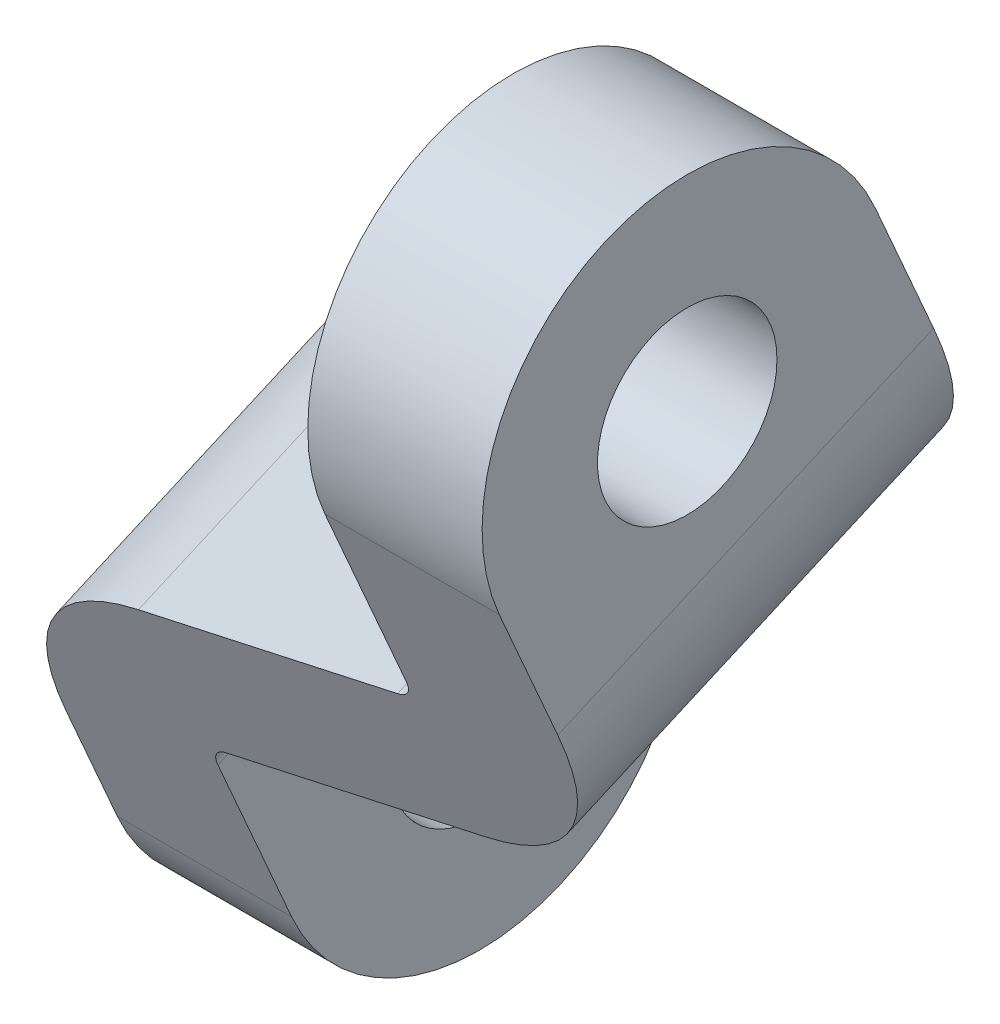
ISO-10303-21;
HEADER;
FILE_DESCRIPTION(('STEP AP214'),'2;1');
FILE_NAME('part.step','',(''),(''),'','','');
FILE_SCHEMA(('AUTOMOTIVE_DESIGN { 1 0 10303 214 1 1 1 1 }'));
ENDSEC;
DATA;
#1=APPLICATION_CONTEXT('core data for automotive mechanical design processes');
#2=APPLICATION_PROTOCOL_DEFINITION('international standard','automotive_design',2000,#1);
#3=PRODUCT_CONTEXT('',#1,'mechanical');
#4=PRODUCT('Part','Part','',(#3));
#5=PRODUCT_RELATED_PRODUCT_CATEGORY('part','',(#4));
#6=PRODUCT_DEFINITION_FORMATION('','',#4);
#7=PRODUCT_DEFINITION_CONTEXT('part definition',#1,'design');
#8=PRODUCT_DEFINITION('design','',#6,#7);
#9=PRODUCT_DEFINITION_SHAPE('','',#8);
#10=(LENGTH_UNIT() NAMED_UNIT(*) SI_UNIT(.MILLI.,.METRE.));
#11=(NAMED_UNIT(*) PLANE_ANGLE_UNIT() SI_UNIT($,.RADIAN.));
#12=(NAMED_UNIT(*) SI_UNIT($,.STERADIAN.) SOLID_ANGLE_UNIT());
#13=UNCERTAINTY_MEASURE_WITH_UNIT(LENGTH_MEASURE(1.E-05),#10,'distance_accuracy_value','');
#14=(GEOMETRIC_REPRESENTATION_CONTEXT(3) GLOBAL_UNCERTAINTY_ASSIGNED_CONTEXT((#13)) GLOBAL_UNIT_ASSIGNED_CONTEXT((#10,
#11,#12)) REPRESENTATION_CONTEXT('',''));
#15=CARTESIAN_POINT('',(0.,0.,0.));
#16=DIRECTION('',(0.,0.,1.));
#17=DIRECTION('',(1.,0.,0.));
#18=AXIS2_PLACEMENT_3D('',#15,#16,#17);
#19=CARTESIAN_POINT('',(-24.3463708891012,-52.740782844802,-46.45));
#20=DIRECTION('',(-1.,0.,0.));
#21=DIRECTION('',(0.,-1.,0.));
#22=AXIS2_PLACEMENT_3D('',#19,#20,#21);
#23=PLANE('',#22);
#24=DIRECTION('',(0.,0.916054362490367,0.401054117248991));
#25=VECTOR('',#24,1.);
#26=CARTESIAN_POINT('',(-24.3463708891012,-67.0218463854487,-48.3357825500385));
#27=LINE('',#26,#25);
#28=CARTESIAN_POINT('',(-24.3463708891012,-56.9496894845637,-43.9261315947217));
#29=VERTEX_POINT('',#28);
#30=CARTESIAN_POINT('',(-24.3463708891012,-54.3449993137979,-42.7857825500387));
#31=VERTEX_POINT('',#30);
#32=EDGE_CURVE('E179',#29,#31,#27,.T.);
#33=ORIENTED_EDGE('',*,*,#32,.F.);
#34=DIRECTION('',(0.,0.401054117248991,-0.916054362490367));
#35=VECTOR('',#34,1.);
#36=CARTESIAN_POINT('',(-24.3463708891012,-55.3454730155679,-47.590349044683));
#37=LINE('',#36,#35);
#38=CARTESIAN_POINT('',(-24.3463708891012,-53.7412565465718,-51.2545664946447));
#39=VERTEX_POINT('',#38);
#40=EDGE_CURVE('E52',#29,#39,#37,.T.);
#41=ORIENTED_EDGE('',*,*,#40,.T.);
#42=DIRECTION('',(0.,-0.916054362490367,-0.401054117248991));
#43=VECTOR('',#42,1.);
#44=CARTESIAN_POINT('',(-24.3463708891012,-51.136566375806,-50.1142174499617));
#45=LINE('',#44,#43);
#46=CARTESIAN_POINT('',(-24.3463708891012,-51.136566375806,-50.1142174499617));
#47=VERTEX_POINT('',#46);
#48=EDGE_CURVE('E242',#47,#39,#45,.T.);
#49=ORIENTED_EDGE('',*,*,#48,.F.);
#50=CARTESIAN_POINT('',(-24.3463708891012,-52.740782844802,-46.45));
#51=DIRECTION('',(-1.,0.,0.));
#52=DIRECTION('',(0.,-1.,0.));
#53=AXIS2_PLACEMENT_3D('',#50,#51,#52);
#54=CIRCLE('',#53,4.00000000000004);
#55=EDGE_CURVE('E249',#31,#47,#54,.T.);
#56=ORIENTED_EDGE('',*,*,#55,.F.);
#57=EDGE_LOOP('',(#33,#41,#49,#56));
#58=FACE_BOUND('',#57,.T.);
#59=CARTESIAN_POINT('',(-24.3463708891012,-52.740782844802,-46.45));
#60=DIRECTION('',(1.,0.,0.));
#61=DIRECTION('',(0.,0.,-1.));
#62=AXIS2_PLACEMENT_3D('',#59,#60,#61);
#63=CIRCLE('',#62,1.75000000000002);
#64=CARTESIAN_POINT('',(-24.3463708891012,-52.740782844802,-48.2));
#65=VERTEX_POINT('',#64);
#66=EDGE_CURVE('E304',#65,#65,#63,.T.);
#67=ORIENTED_EDGE('',*,*,#66,.F.);
#68=EDGE_LOOP('',(#67));
#69=FACE_BOUND('',#68,.T.);
#70=ADVANCED_FACE('F43',(#58,#69),#23,.F.);
#71=CARTESIAN_POINT('',(-24.3463708891012,-52.740782844802,-46.45));
#72=DIRECTION('',(-1.,0.,0.));
#73=DIRECTION('',(0.,-1.,0.));
#74=AXIS2_PLACEMENT_3D('',#71,#72,#73);
#75=CYLINDRICAL_SURFACE('',#74,4.00000000000004);
#76=CARTESIAN_POINT('',(-27.7463708891012,-52.740782844802,-46.45));
#77=DIRECTION('',(1.,0.,0.));
#78=DIRECTION('',(0.,0.,-1.));
#79=AXIS2_PLACEMENT_3D('',#76,#77,#78);
#80=CIRCLE('',#79,4.00000000000004);
#81=CARTESIAN_POINT('',(-27.7463708891012,-54.3449993137979,-42.7857825500387));
#82=VERTEX_POINT('',#81);
#83=CARTESIAN_POINT('',(-27.7463708891012,-51.136566375806,-50.1142174499617));
#84=VERTEX_POINT('',#83);
#85=EDGE_CURVE('E188',#82,#84,#80,.F.);
#86=ORIENTED_EDGE('',*,*,#85,.F.);
#87=DIRECTION('',(-1.,0.,0.));
#88=VECTOR('',#87,1.);
#89=CARTESIAN_POINT('',(-24.3463708891012,-54.3449993137979,-42.7857825500387));
#90=LINE('',#89,#88);
#91=EDGE_CURVE('E165',#31,#82,#90,.T.);
#92=ORIENTED_EDGE('',*,*,#91,.F.);
#93=ORIENTED_EDGE('',*,*,#55,.T.);
#94=DIRECTION('',(-1.,0.,0.));
#95=VECTOR('',#94,1.);
#96=CARTESIAN_POINT('',(-24.3463708891012,-51.136566375806,-50.1142174499617));
#97=LINE('',#96,#95);
#98=EDGE_CURVE('E172',#47,#84,#97,.T.);
#99=ORIENTED_EDGE('',*,*,#98,.T.);
#100=EDGE_LOOP('',(#86,#92,#93,#99));
#101=FACE_BOUND('',#100,.T.);
#102=ADVANCED_FACE('F311',(#101),#75,.T.);
#103=CARTESIAN_POINT('',(-24.3463708891012,-67.0218463854487,-48.3357825500385));
#104=DIRECTION('',(0.,-0.401054117248991,0.916054362490367));
#105=DIRECTION('',(0.,-0.916054362490367,-0.401054117248991));
#106=AXIS2_PLACEMENT_3D('',#103,#104,#105);
#107=PLANE('',#106);
#108=DIRECTION('',(-0.939692620785908,-0.31330904435306,-0.13716858666285));
#109=VECTOR('',#108,1.);
#110=CARTESIAN_POINT('',(-27.787499471829,-58.3610808795735,-44.5440472481985));
#111=LINE('',#110,#109);
#112=CARTESIAN_POINT('',(-34.0564716057295,-60.4512597581792,-45.4591401502974));
#113=VERTEX_POINT('',#112);
#114=CARTESIAN_POINT('',(-28.1411588031058,-58.4789967433974,-44.595671523582));
#115=VERTEX_POINT('',#114);
#116=EDGE_CURVE('E157',#113,#115,#111,.F.);
#117=ORIENTED_EDGE('',*,*,#116,.F.);
#118=CARTESIAN_POINT('',(-32.3463708891012,-64.7553073815339,-47.3434781228708));
#119=DIRECTION('',(0.,-0.401054117248991,0.916054362490367));
#120=DIRECTION('',(0.,-0.916054362490367,-0.401054117248991));
#121=AXIS2_PLACEMENT_3D('',#118,#119,#120);
#122=CIRCLE('',#121,5.);
#123=CARTESIAN_POINT('',(-37.3463708891012,-64.7553073815339,-47.3434781228708));
#124=VERTEX_POINT('',#123);
#125=EDGE_CURVE('E226',#113,#124,#122,.T.);
#126=ORIENTED_EDGE('',*,*,#125,.T.);
#127=DIRECTION('',(0.,0.916054362490367,0.401054117248991));
#128=VECTOR('',#127,1.);
#129=CARTESIAN_POINT('',(-37.3463708891012,-67.0218463854487,-48.3357825500385));
#130=LINE('',#129,#128);
#131=CARTESIAN_POINT('',(-37.3463708891012,-67.0218463854487,-48.3357825500385));
#132=VERTEX_POINT('',#131);
#133=EDGE_CURVE('E163',#132,#124,#130,.T.);
#134=ORIENTED_EDGE('',*,*,#133,.F.);
#135=DIRECTION('',(-1.,0.,0.));
#136=VECTOR('',#135,1.);
#137=CARTESIAN_POINT('',(-24.3463708891012,-67.0218463854487,-48.3357825500385));
#138=LINE('',#137,#136);
#139=CARTESIAN_POINT('',(-33.9463708891012,-67.0218463854487,-48.3357825500385));
#140=VERTEX_POINT('',#139);
#141=EDGE_CURVE('E152',#140,#132,#138,.T.);
#142=ORIENTED_EDGE('',*,*,#141,.F.);
#143=DIRECTION('',(0.,-0.916054362490367,-0.401054117248991));
#144=VECTOR('',#143,1.);
#145=CARTESIAN_POINT('',(-33.9463708891012,-63.3576289354874,-46.7315660810426));
#146=LINE('',#145,#144);
#147=CARTESIAN_POINT('',(-33.9463708891012,-63.7424858375028,-46.9000587507193));
#148=VERTEX_POINT('',#147);
#149=EDGE_CURVE('E133',#148,#140,#146,.T.);
#150=ORIENTED_EDGE('',*,*,#149,.F.);
#151=CARTESIAN_POINT('',(-33.3463708891012,-63.7424858375028,-46.9000587507193));
#152=DIRECTION('',(0.,-0.401054117248991,0.916054362490367));
#153=DIRECTION('',(0.,-0.916054362490367,-0.401054117248991));
#154=AXIS2_PLACEMENT_3D('',#151,#152,#153);
#155=CIRCLE('',#154,0.6);
#156=CARTESIAN_POINT('',(-33.5515829750966,-63.2260001227003,-46.6739381940105));
#157=VERTEX_POINT('',#156);
#158=EDGE_CURVE('E213',#148,#157,#155,.F.);
#159=ORIENTED_EDGE('',*,*,#158,.T.);
#160=DIRECTION('',(-0.939692620785909,-0.313309044353058,-0.137168586662848));
#161=VECTOR('',#160,1.);
#162=CARTESIAN_POINT('',(-18.2703377056118,-58.1309804896816,-44.4433079116204));
#163=LINE('',#162,#161);
#164=CARTESIAN_POINT('',(-27.6362701724729,-61.2537371079184,-45.8104695672952));
#165=VERTEX_POINT('',#164);
#166=EDGE_CURVE('E146',#165,#157,#163,.T.);
#167=ORIENTED_EDGE('',*,*,#166,.F.);
#168=CARTESIAN_POINT('',(-29.3463708891012,-56.9496894845637,-43.9261315947217));
#169=DIRECTION('',(0.,-0.401054117248991,0.916054362490367));
#170=DIRECTION('',(0.,-0.916054362490367,-0.401054117248991));
#171=AXIS2_PLACEMENT_3D('',#168,#169,#170);
#172=CIRCLE('',#171,5.);
#173=EDGE_CURVE('E223',#165,#29,#172,.T.);
#174=ORIENTED_EDGE('',*,*,#173,.T.);
#175=ORIENTED_EDGE('',*,*,#32,.T.);
#176=ORIENTED_EDGE('',*,*,#91,.T.);
#177=DIRECTION('',(0.,0.916054362490367,0.401054117248991));
#178=VECTOR('',#177,1.);
#179=CARTESIAN_POINT('',(-27.7463708891012,-61.5481665314057,-45.9393725422319));
#180=LINE('',#179,#178);
#181=CARTESIAN_POINT('',(-27.7463708891012,-57.9625110285948,-44.3695509668732));
#182=VERTEX_POINT('',#181);
#183=EDGE_CURVE('E189',#182,#82,#180,.T.);
#184=ORIENTED_EDGE('',*,*,#183,.F.);
#185=CARTESIAN_POINT('',(-28.3463708891012,-57.9625110285948,-44.3695509668732));
#186=DIRECTION('',(0.,-0.401054117248991,0.916054362490367));
#187=DIRECTION('',(0.,-0.916054362490367,-0.401054117248991));
#188=AXIS2_PLACEMENT_3D('',#185,#186,#187);
#189=CIRCLE('',#188,0.6);
#190=EDGE_CURVE('E206',#182,#115,#189,.F.);
#191=ORIENTED_EDGE('',*,*,#190,.T.);
#192=EDGE_LOOP('',(#117,#126,#134,#142,#150,#159,#167,#174,#175,#176,#184,#191));
#193=FACE_BOUND('',#192,.T.);
#194=ADVANCED_FACE('F161',(#193),#107,.T.);
#195=CARTESIAN_POINT('',(-24.3463708891012,-65.4176299164527,-52.));
#196=DIRECTION('',(-1.,0.,0.));
#197=DIRECTION('',(0.,-1.,0.));
#198=AXIS2_PLACEMENT_3D('',#195,#196,#197);
#199=CYLINDRICAL_SURFACE('',#198,4.00000000000004);
#200=CARTESIAN_POINT('',(-33.9463708891012,-65.4176299164527,-52.));
#201=DIRECTION('',(-1.,0.,0.));
#202=DIRECTION('',(0.,0.,1.));
#203=AXIS2_PLACEMENT_3D('',#200,#201,#202);
#204=CIRCLE('',#203,4.00000000000004);
#205=CARTESIAN_POINT('',(-33.9463708891012,-63.8134134474567,-55.6642174499615));
#206=VERTEX_POINT('',#205);
#207=EDGE_CURVE('E137',#140,#206,#204,.F.);
#208=ORIENTED_EDGE('',*,*,#207,.F.);
#209=ORIENTED_EDGE('',*,*,#141,.T.);
#210=CARTESIAN_POINT('',(-37.3463708891012,-65.4176299164527,-52.));
#211=DIRECTION('',(-1.,0.,0.));
#212=DIRECTION('',(0.,-1.,0.));
#213=AXIS2_PLACEMENT_3D('',#210,#211,#212);
#214=CIRCLE('',#213,4.00000000000004);
#215=CARTESIAN_POINT('',(-37.3463708891012,-63.8134134474567,-55.6642174499615));
#216=VERTEX_POINT('',#215);
#217=EDGE_CURVE('E260',#216,#132,#214,.T.);
#218=ORIENTED_EDGE('',*,*,#217,.F.);
#219=DIRECTION('',(-1.,0.,0.));
#220=VECTOR('',#219,1.);
#221=CARTESIAN_POINT('',(-24.3463708891012,-63.8134134474567,-55.6642174499615));
#222=LINE('',#221,#220);
#223=EDGE_CURVE('E155',#206,#216,#222,.T.);
#224=ORIENTED_EDGE('',*,*,#223,.F.);
#225=EDGE_LOOP('',(#208,#209,#218,#224));
#226=FACE_BOUND('',#225,.T.);
#227=ADVANCED_FACE('F150',(#226),#199,.T.);
#228=CARTESIAN_POINT('',(-24.3463708891012,-51.136566375806,-50.1142174499617));
#229=DIRECTION('',(0.,0.401054117248991,-0.916054362490367));
#230=DIRECTION('',(0.,0.916054362490367,0.401054117248991));
#231=AXIS2_PLACEMENT_3D('',#228,#229,#230);
#232=PLANE('',#231);
#233=DIRECTION('',(0.,-0.916054362490367,-0.401054117248991));
#234=VECTOR('',#233,1.);
#235=CARTESIAN_POINT('',(-37.3463708891012,-51.136566375806,-50.1142174499617));
#236=LINE('',#235,#234);
#237=CARTESIAN_POINT('',(-37.3463708891012,-61.5468744435419,-54.6719130227938));
#238=VERTEX_POINT('',#237);
#239=EDGE_CURVE('E257',#238,#216,#236,.T.);
#240=ORIENTED_EDGE('',*,*,#239,.F.);
#241=CARTESIAN_POINT('',(-32.3463708891012,-61.5468744435419,-54.6719130227938));
#242=DIRECTION('',(0.,0.401054117248991,-0.916054362490367));
#243=DIRECTION('',(0.,0.916054362490367,0.401054117248991));
#244=AXIS2_PLACEMENT_3D('',#241,#242,#243);
#245=CIRCLE('',#244,5.);
#246=CARTESIAN_POINT('',(-34.0564716057295,-57.2428268201872,-52.7875750502204));
#247=VERTEX_POINT('',#246);
#248=EDGE_CURVE('E234',#238,#247,#245,.T.);
#249=ORIENTED_EDGE('',*,*,#248,.T.);
#250=DIRECTION('',(0.939692620785908,0.31330904435306,0.13716858666285));
#251=VECTOR('',#250,1.);
#252=CARTESIAN_POINT('',(-23.3398812074523,-53.6697385335097,-51.2232554777767));
#253=LINE('',#252,#251);
#254=CARTESIAN_POINT('',(-28.1411588031058,-55.2705638054054,-51.9241064235051));
#255=VERTEX_POINT('',#254);
#256=EDGE_CURVE('E184',#255,#247,#253,.F.);
#257=ORIENTED_EDGE('',*,*,#256,.F.);
#258=CARTESIAN_POINT('',(-28.3463708891012,-54.7540780906028,-51.6979858667962));
#259=DIRECTION('',(0.,0.401054117248991,-0.916054362490367));
#260=DIRECTION('',(0.,0.916054362490367,0.401054117248991));
#261=AXIS2_PLACEMENT_3D('',#258,#259,#260);
#262=CIRCLE('',#261,0.6);
#263=CARTESIAN_POINT('',(-27.7463708891012,-54.7540780906028,-51.6979858667962));
#264=VERTEX_POINT('',#263);
#265=EDGE_CURVE('E210',#255,#264,#262,.F.);
#266=ORIENTED_EDGE('',*,*,#265,.T.);
#267=DIRECTION('',(0.,-0.916054362490367,-0.401054117248991));
#268=VECTOR('',#267,1.);
#269=CARTESIAN_POINT('',(-27.7463708891012,-51.136566375806,-50.1142174499617));
#270=LINE('',#269,#268);
#271=EDGE_CURVE('E170',#84,#264,#270,.T.);
#272=ORIENTED_EDGE('',*,*,#271,.F.);
#273=ORIENTED_EDGE('',*,*,#98,.F.);
#274=ORIENTED_EDGE('',*,*,#48,.T.);
#275=CARTESIAN_POINT('',(-29.3463708891012,-53.7412565465718,-51.2545664946447));
#276=DIRECTION('',(0.,0.401054117248991,-0.916054362490367));
#277=DIRECTION('',(0.,0.916054362490367,0.401054117248991));
#278=AXIS2_PLACEMENT_3D('',#275,#276,#277);
#279=CIRCLE('',#278,5.);
#280=CARTESIAN_POINT('',(-27.6362701724729,-58.0453041699265,-53.1389044672182));
#281=VERTEX_POINT('',#280);
#282=EDGE_CURVE('E59',#39,#281,#279,.T.);
#283=ORIENTED_EDGE('',*,*,#282,.T.);
#284=DIRECTION('',(0.939692620785909,0.313309044353057,0.137168586662849));
#285=VECTOR('',#284,1.);
#286=CARTESIAN_POINT('',(-22.3073145171264,-56.2685423152042,-52.3610274258708));
#287=LINE('',#286,#285);
#288=CARTESIAN_POINT('',(-33.5515829750966,-60.0175671847083,-54.0023730939335));
#289=VERTEX_POINT('',#288);
#290=EDGE_CURVE('E145',#289,#281,#287,.T.);
#291=ORIENTED_EDGE('',*,*,#290,.F.);
#292=CARTESIAN_POINT('',(-33.3463708891012,-60.5340528995109,-54.2284936506423));
#293=DIRECTION('',(0.,0.401054117248991,-0.916054362490367));
#294=DIRECTION('',(0.,0.916054362490367,0.401054117248991));
#295=AXIS2_PLACEMENT_3D('',#292,#293,#294);
#296=CIRCLE('',#295,0.6);
#297=CARTESIAN_POINT('',(-33.9463708891012,-60.5340528995109,-54.2284936506423));
#298=VERTEX_POINT('',#297);
#299=EDGE_CURVE('E216',#289,#298,#296,.F.);
#300=ORIENTED_EDGE('',*,*,#299,.T.);
#301=DIRECTION('',(0.,0.916054362490367,0.401054117248991));
#302=VECTOR('',#301,1.);
#303=CARTESIAN_POINT('',(-33.9463708891012,-51.136566375806,-50.1142174499617));
#304=LINE('',#303,#302);
#305=EDGE_CURVE('E183',#206,#298,#304,.T.);
#306=ORIENTED_EDGE('',*,*,#305,.F.);
#307=ORIENTED_EDGE('',*,*,#223,.T.);
#308=EDGE_LOOP('',(#240,#249,#257,#266,#272,#273,#274,#283,#291,#300,#306,#307));
#309=FACE_BOUND('',#308,.T.);
#310=ADVANCED_FACE('F246',(#309),#232,.T.);
#311=CARTESIAN_POINT('',(-37.3463708891012,-52.740782844802,-46.45));
#312=DIRECTION('',(-1.,0.,0.));
#313=DIRECTION('',(0.,-1.,0.));
#314=AXIS2_PLACEMENT_3D('',#311,#312,#313);
#315=PLANE('',#314);
#316=CARTESIAN_POINT('',(-37.3463708891012,-65.4176299164527,-52.));
#317=DIRECTION('',(-1.,0.,0.));
#318=DIRECTION('',(0.,0.,1.));
#319=AXIS2_PLACEMENT_3D('',#316,#317,#318);
#320=CIRCLE('',#319,1.75000000000002);
#321=CARTESIAN_POINT('',(-37.3463708891012,-65.4176299164527,-50.25));
#322=VERTEX_POINT('',#321);
#323=EDGE_CURVE('E296',#322,#322,#320,.T.);
#324=ORIENTED_EDGE('',*,*,#323,.F.);
#325=EDGE_LOOP('',(#324));
#326=FACE_BOUND('',#325,.T.);
#327=ORIENTED_EDGE('',*,*,#133,.T.);
#328=DIRECTION('',(0.,0.401054117248991,-0.916054362490367));
#329=VECTOR('',#328,1.);
#330=CARTESIAN_POINT('',(-37.3463708891012,-61.5468744435419,-54.6719130227938));
#331=LINE('',#330,#329);
#332=EDGE_CURVE('E229',#124,#238,#331,.T.);
#333=ORIENTED_EDGE('',*,*,#332,.T.);
#334=ORIENTED_EDGE('',*,*,#239,.T.);
#335=ORIENTED_EDGE('',*,*,#217,.T.);
#336=EDGE_LOOP('',(#327,#333,#334,#335));
#337=FACE_BOUND('',#336,.T.);
#338=ADVANCED_FACE('F265',(#326,#337),#315,.T.);
#339=CARTESIAN_POINT('',(-27.7463708891012,-55.792023023719,-59.0870754196053));
#340=DIRECTION('',(1.,0.,0.));
#341=DIRECTION('',(0.,0.,-1.));
#342=AXIS2_PLACEMENT_3D('',#339,#340,#341);
#343=PLANE('',#342);
#344=CARTESIAN_POINT('',(-27.7463708891012,-52.740782844802,-46.45));
#345=DIRECTION('',(1.,0.,0.));
#346=DIRECTION('',(0.,0.,-1.));
#347=AXIS2_PLACEMENT_3D('',#344,#345,#346);
#348=CIRCLE('',#347,1.75000000000002);
#349=CARTESIAN_POINT('',(-27.7463708891012,-52.740782844802,-48.2));
#350=VERTEX_POINT('',#349);
#351=EDGE_CURVE('E300',#350,#350,#348,.T.);
#352=ORIENTED_EDGE('',*,*,#351,.T.);
#353=EDGE_LOOP('',(#352));
#354=FACE_BOUND('',#353,.T.);
#355=ORIENTED_EDGE('',*,*,#271,.T.);
#356=DIRECTION('',(0.,0.401054117248991,-0.916054362490367));
#357=VECTOR('',#356,1.);
#358=CARTESIAN_POINT('',(-27.7463708891012,-57.9625110285948,-44.3695509668732));
#359=LINE('',#358,#357);
#360=EDGE_CURVE('E194',#264,#182,#359,.F.);
#361=ORIENTED_EDGE('',*,*,#360,.T.);
#362=ORIENTED_EDGE('',*,*,#183,.T.);
#363=ORIENTED_EDGE('',*,*,#85,.T.);
#364=EDGE_LOOP('',(#355,#361,#362,#363));
#365=FACE_BOUND('',#364,.T.);
#366=ADVANCED_FACE('F279',(#354,#365),#343,.F.);
#367=CARTESIAN_POINT('',(-37.3463708891012,-59.9439500624098,-49.6035899921932));
#368=DIRECTION('',(-0.342020143325669,0.860809524670937,0.376867594514683));
#369=DIRECTION('',(0.,-0.401054117248991,0.916054362490367));
#370=AXIS2_PLACEMENT_3D('',#367,#368,#369);
#371=PLANE('',#370);
#372=ORIENTED_EDGE('',*,*,#256,.T.);
#373=DIRECTION('',(0.,-0.401054117248991,0.916054362490367));
#374=VECTOR('',#373,1.);
#375=CARTESIAN_POINT('',(-34.0564716057295,-60.4512597581792,-45.4591401502974));
#376=LINE('',#375,#374);
#377=EDGE_CURVE('E219',#247,#113,#376,.T.);
#378=ORIENTED_EDGE('',*,*,#377,.T.);
#379=ORIENTED_EDGE('',*,*,#116,.T.);
#380=DIRECTION('',(0.,-0.401054117248991,0.916054362490367));
#381=VECTOR('',#380,1.);
#382=CARTESIAN_POINT('',(-28.1411588031058,-55.2705638054054,-51.9241064235051));
#383=LINE('',#382,#381);
#384=EDGE_CURVE('E198',#115,#255,#383,.F.);
#385=ORIENTED_EDGE('',*,*,#384,.T.);
#386=EDGE_LOOP('',(#372,#378,#379,#385));
#387=FACE_BOUND('',#386,.T.);
#388=ADVANCED_FACE('F273',(#387),#371,.T.);
#389=CARTESIAN_POINT('',(-33.9463708891012,-57.6014854278007,-59.879268958416));
#390=DIRECTION('',(-1.,0.,0.));
#391=DIRECTION('',(0.,0.,1.));
#392=AXIS2_PLACEMENT_3D('',#389,#390,#391);
#393=PLANE('',#392);
#394=CARTESIAN_POINT('',(-33.9463708891012,-65.4176299164527,-52.));
#395=DIRECTION('',(-1.,0.,0.));
#396=DIRECTION('',(0.,0.,1.));
#397=AXIS2_PLACEMENT_3D('',#394,#395,#396);
#398=CIRCLE('',#397,1.75000000000002);
#399=CARTESIAN_POINT('',(-33.9463708891012,-65.4176299164527,-50.25));
#400=VERTEX_POINT('',#399);
#401=EDGE_CURVE('E292',#400,#400,#398,.T.);
#402=ORIENTED_EDGE('',*,*,#401,.T.);
#403=EDGE_LOOP('',(#402));
#404=FACE_BOUND('',#403,.T.);
#405=ORIENTED_EDGE('',*,*,#305,.T.);
#406=DIRECTION('',(0.,-0.401054117248991,0.916054362490367));
#407=VECTOR('',#406,1.);
#408=CARTESIAN_POINT('',(-33.9463708891012,-63.7424858375028,-46.9000587507193));
#409=LINE('',#408,#407);
#410=EDGE_CURVE('E140',#298,#148,#409,.T.);
#411=ORIENTED_EDGE('',*,*,#410,.T.);
#412=ORIENTED_EDGE('',*,*,#149,.T.);
#413=ORIENTED_EDGE('',*,*,#207,.T.);
#414=EDGE_LOOP('',(#405,#411,#412,#413));
#415=FACE_BOUND('',#414,.T.);
#416=ADVANCED_FACE('F136',(#404,#415),#393,.F.);
#417=CARTESIAN_POINT('',(-18.2703377056118,-52.3748369819949,-57.5910107889938));
#418=DIRECTION('',(-0.342020143325667,0.860809524670938,0.376867594514683));
#419=DIRECTION('',(0.,-0.401054117248991,0.916054362490367));
#420=AXIS2_PLACEMENT_3D('',#417,#418,#419);
#421=PLANE('',#420);
#422=ORIENTED_EDGE('',*,*,#290,.T.);
#423=DIRECTION('',(0.,0.401054117248991,-0.916054362490367));
#424=VECTOR('',#423,1.);
#425=CARTESIAN_POINT('',(-27.6362701724729,-55.4975936002317,-58.9581724446685));
#426=LINE('',#425,#424);
#427=EDGE_CURVE('E11',#281,#165,#426,.F.);
#428=ORIENTED_EDGE('',*,*,#427,.T.);
#429=ORIENTED_EDGE('',*,*,#166,.T.);
#430=DIRECTION('',(0.,-0.401054117248991,0.916054362490367));
#431=VECTOR('',#430,1.);
#432=CARTESIAN_POINT('',(-33.5515829750966,-60.0175671847083,-54.0023730939335));
#433=LINE('',#432,#431);
#434=EDGE_CURVE('E203',#157,#289,#433,.F.);
#435=ORIENTED_EDGE('',*,*,#434,.T.);
#436=EDGE_LOOP('',(#422,#428,#429,#435));
#437=FACE_BOUND('',#436,.T.);
#438=ADVANCED_FACE('F345',(#437),#421,.F.);
#439=CARTESIAN_POINT('',(-37.3463708891012,-65.4176299164527,-52.));
#440=DIRECTION('',(-1.,0.,0.));
#441=DIRECTION('',(0.,0.,1.));
#442=AXIS2_PLACEMENT_3D('',#439,#440,#441);
#443=CYLINDRICAL_SURFACE('',#442,1.75000000000002);
#444=ORIENTED_EDGE('',*,*,#401,.F.);
#445=EDGE_LOOP('',(#444));
#446=FACE_BOUND('',#445,.T.);
#447=ORIENTED_EDGE('',*,*,#323,.T.);
#448=EDGE_LOOP('',(#447));
#449=FACE_BOUND('',#448,.T.);
#450=ADVANCED_FACE('F348',(#446,#449),#443,.F.);
#451=CARTESIAN_POINT('',(-24.3463708891012,-52.740782844802,-46.45));
#452=DIRECTION('',(1.,0.,0.));
#453=DIRECTION('',(0.,0.,-1.));
#454=AXIS2_PLACEMENT_3D('',#451,#452,#453);
#455=CYLINDRICAL_SURFACE('',#454,1.75000000000002);
#456=ORIENTED_EDGE('',*,*,#351,.F.);
#457=EDGE_LOOP('',(#456));
#458=FACE_BOUND('',#457,.T.);
#459=ORIENTED_EDGE('',*,*,#66,.T.);
#460=EDGE_LOOP('',(#459));
#461=FACE_BOUND('',#460,.T.);
#462=ADVANCED_FACE('F309',(#458,#461),#455,.F.);
#463=CARTESIAN_POINT('',(-28.3463708891012,-52.2063675209081,-57.5172538442466));
#464=DIRECTION('',(0.,-0.401054117248991,0.916054362490367));
#465=DIRECTION('',(0.,-0.916054362490367,-0.401054117248991));
#466=AXIS2_PLACEMENT_3D('',#463,#464,#465);
#467=CYLINDRICAL_SURFACE('',#466,0.6);
#468=ORIENTED_EDGE('',*,*,#265,.F.);
#469=ORIENTED_EDGE('',*,*,#384,.F.);
#470=ORIENTED_EDGE('',*,*,#190,.F.);
#471=ORIENTED_EDGE('',*,*,#360,.F.);
#472=EDGE_LOOP('',(#468,#469,#470,#471));
#473=FACE_BOUND('',#472,.T.);
#474=ADVANCED_FACE('F276',(#473),#467,.F.);
#475=CARTESIAN_POINT('',(-33.3463708891012,-57.9863423298161,-60.0477616280927));
#476=DIRECTION('',(0.,0.401054117248991,-0.916054362490367));
#477=DIRECTION('',(0.,0.916054362490367,0.401054117248991));
#478=AXIS2_PLACEMENT_3D('',#475,#476,#477);
#479=CYLINDRICAL_SURFACE('',#478,0.6);
#480=ORIENTED_EDGE('',*,*,#299,.F.);
#481=ORIENTED_EDGE('',*,*,#434,.F.);
#482=ORIENTED_EDGE('',*,*,#158,.F.);
#483=ORIENTED_EDGE('',*,*,#410,.F.);
#484=EDGE_LOOP('',(#480,#481,#482,#483));
#485=FACE_BOUND('',#484,.T.);
#486=ADVANCED_FACE('F333',(#485),#479,.F.);
#487=CARTESIAN_POINT('',(-32.3463708891012,-63.151090912538,-51.0076955728321));
#488=DIRECTION('',(0.,-0.401054117248991,0.916054362490367));
#489=DIRECTION('',(0.,-0.916054362490367,-0.401054117248991));
#490=AXIS2_PLACEMENT_3D('',#487,#488,#489);
#491=CYLINDRICAL_SURFACE('',#490,5.);
#492=ORIENTED_EDGE('',*,*,#248,.F.);
#493=ORIENTED_EDGE('',*,*,#332,.F.);
#494=ORIENTED_EDGE('',*,*,#125,.F.);
#495=ORIENTED_EDGE('',*,*,#377,.F.);
#496=EDGE_LOOP('',(#492,#493,#494,#495));
#497=FACE_BOUND('',#496,.T.);
#498=ADVANCED_FACE('F268',(#497),#491,.T.);
#499=CARTESIAN_POINT('',(-29.3463708891012,-55.3454730155679,-47.590349044683));
#500=DIRECTION('',(0.,0.401054117248991,-0.916054362490367));
#501=DIRECTION('',(0.,0.916054362490367,0.401054117248991));
#502=AXIS2_PLACEMENT_3D('',#499,#500,#501);
#503=CYLINDRICAL_SURFACE('',#502,5.);
#504=ORIENTED_EDGE('',*,*,#173,.F.);
#505=ORIENTED_EDGE('',*,*,#427,.F.);
#506=ORIENTED_EDGE('',*,*,#282,.F.);
#507=ORIENTED_EDGE('',*,*,#40,.F.);
#508=EDGE_LOOP('',(#504,#505,#506,#507));
#509=FACE_BOUND('',#508,.T.);
#510=ADVANCED_FACE('F45',(#509),#503,.T.);
#511=CLOSED_SHELL('',(#70,#102,#194,#227,#310,#338,#366,#388,#416,#438,#450,#462,#474,#486,#498,#510));
#512=MANIFOLD_SOLID_BREP('B2',#511);
#513=ADVANCED_BREP_SHAPE_REPRESENTATION('',(#18,#512),#14);
#514=SHAPE_DEFINITION_REPRESENTATION(#9,#513);
ENDSEC;
END-ISO-10303-21;
